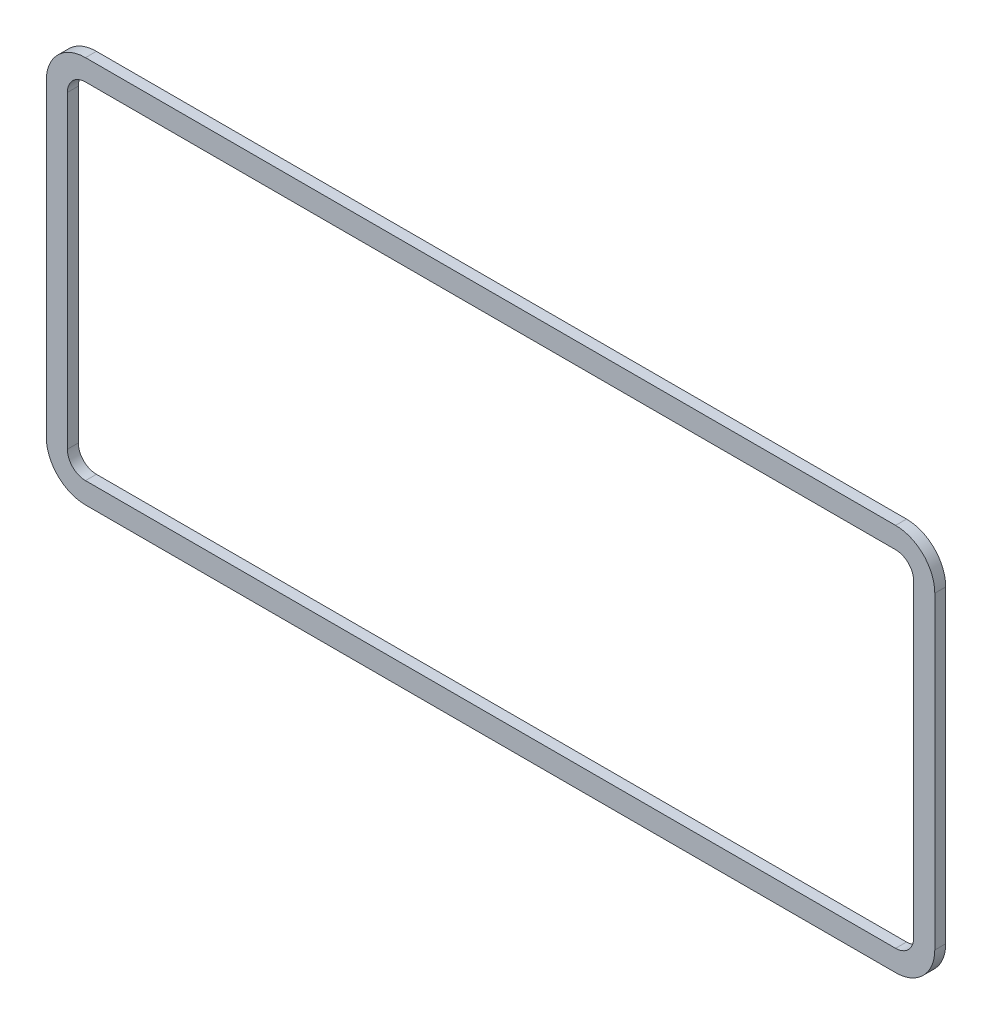
ISO-10303-21;
HEADER;
FILE_DESCRIPTION(('STEP AP214'),'2;1');
FILE_NAME('part.step','',(''),(''),'','','');
FILE_SCHEMA(('AUTOMOTIVE_DESIGN { 1 0 10303 214 1 1 1 1 }'));
ENDSEC;
DATA;
#1=APPLICATION_CONTEXT('core data for automotive mechanical design processes');
#2=APPLICATION_PROTOCOL_DEFINITION('international standard','automotive_design',2000,#1);
#3=PRODUCT_CONTEXT('',#1,'mechanical');
#4=PRODUCT('Part','Part','',(#3));
#5=PRODUCT_RELATED_PRODUCT_CATEGORY('part','',(#4));
#6=PRODUCT_DEFINITION_FORMATION('','',#4);
#7=PRODUCT_DEFINITION_CONTEXT('part definition',#1,'design');
#8=PRODUCT_DEFINITION('design','',#6,#7);
#9=PRODUCT_DEFINITION_SHAPE('','',#8);
#10=(LENGTH_UNIT() NAMED_UNIT(*) SI_UNIT(.MILLI.,.METRE.));
#11=(NAMED_UNIT(*) PLANE_ANGLE_UNIT() SI_UNIT($,.RADIAN.));
#12=(NAMED_UNIT(*) SI_UNIT($,.STERADIAN.) SOLID_ANGLE_UNIT());
#13=UNCERTAINTY_MEASURE_WITH_UNIT(LENGTH_MEASURE(1.E-05),#10,'distance_accuracy_value','');
#14=(GEOMETRIC_REPRESENTATION_CONTEXT(3) GLOBAL_UNCERTAINTY_ASSIGNED_CONTEXT((#13)) GLOBAL_UNIT_ASSIGNED_CONTEXT((#10,
#11,#12)) REPRESENTATION_CONTEXT('',''));
#15=CARTESIAN_POINT('',(0.,0.,0.));
#16=DIRECTION('',(0.,0.,1.));
#17=DIRECTION('',(1.,0.,0.));
#18=AXIS2_PLACEMENT_3D('',#15,#16,#17);
#19=CARTESIAN_POINT('',(-73.914,-28.194,0.));
#20=DIRECTION('',(0.,0.,1.));
#21=DIRECTION('',(1.,0.,0.));
#22=AXIS2_PLACEMENT_3D('',#19,#20,#21);
#23=PLANE('',#22);
#24=CARTESIAN_POINT('',(-73.914,-28.194,0.));
#25=DIRECTION('',(0.,0.,1.));
#26=DIRECTION('',(1.,0.,0.));
#27=AXIS2_PLACEMENT_3D('',#24,#25,#26);
#28=CIRCLE('',#27,7.15009999999999);
#29=CARTESIAN_POINT('',(-81.0641,-28.194,0.));
#30=VERTEX_POINT('',#29);
#31=CARTESIAN_POINT('',(-73.914,-35.3441,0.));
#32=VERTEX_POINT('',#31);
#33=EDGE_CURVE('E180',#30,#32,#28,.T.);
#34=ORIENTED_EDGE('',*,*,#33,.F.);
#35=DIRECTION('',(0.,-1.,0.));
#36=VECTOR('',#35,1.);
#37=CARTESIAN_POINT('',(-81.0641,28.194,0.));
#38=LINE('',#37,#36);
#39=CARTESIAN_POINT('',(-81.0641,28.194,0.));
#40=VERTEX_POINT('',#39);
#41=EDGE_CURVE('E134',#40,#30,#38,.T.);
#42=ORIENTED_EDGE('',*,*,#41,.F.);
#43=CARTESIAN_POINT('',(-73.914,28.194,0.));
#44=DIRECTION('',(0.,0.,1.));
#45=DIRECTION('',(1.,0.,0.));
#46=AXIS2_PLACEMENT_3D('',#43,#44,#45);
#47=CIRCLE('',#46,7.15009999999997);
#48=CARTESIAN_POINT('',(-73.914,35.3441,0.));
#49=VERTEX_POINT('',#48);
#50=EDGE_CURVE('E174',#49,#40,#47,.T.);
#51=ORIENTED_EDGE('',*,*,#50,.F.);
#52=DIRECTION('',(-1.,0.,0.));
#53=VECTOR('',#52,1.);
#54=CARTESIAN_POINT('',(73.9139999999999,35.3441,0.));
#55=LINE('',#54,#53);
#56=CARTESIAN_POINT('',(73.9139999999999,35.3441,0.));
#57=VERTEX_POINT('',#56);
#58=EDGE_CURVE('E170',#57,#49,#55,.T.);
#59=ORIENTED_EDGE('',*,*,#58,.F.);
#60=CARTESIAN_POINT('',(73.914,28.194,0.));
#61=DIRECTION('',(0.,0.,1.));
#62=DIRECTION('',(1.,0.,0.));
#63=AXIS2_PLACEMENT_3D('',#60,#61,#62);
#64=CIRCLE('',#63,7.1501);
#65=CARTESIAN_POINT('',(81.0641,28.194,0.));
#66=VERTEX_POINT('',#65);
#67=EDGE_CURVE('E166',#66,#57,#64,.T.);
#68=ORIENTED_EDGE('',*,*,#67,.F.);
#69=DIRECTION('',(0.,1.,0.));
#70=VECTOR('',#69,1.);
#71=CARTESIAN_POINT('',(81.0641,-28.194,0.));
#72=LINE('',#71,#70);
#73=CARTESIAN_POINT('',(81.0641,-28.194,0.));
#74=VERTEX_POINT('',#73);
#75=EDGE_CURVE('E162',#74,#66,#72,.T.);
#76=ORIENTED_EDGE('',*,*,#75,.F.);
#77=CARTESIAN_POINT('',(73.914,-28.194,0.));
#78=DIRECTION('',(0.,0.,1.));
#79=DIRECTION('',(1.,0.,0.));
#80=AXIS2_PLACEMENT_3D('',#77,#78,#79);
#81=CIRCLE('',#80,7.15009999999999);
#82=CARTESIAN_POINT('',(73.914,-35.3441,0.));
#83=VERTEX_POINT('',#82);
#84=EDGE_CURVE('E158',#83,#74,#81,.T.);
#85=ORIENTED_EDGE('',*,*,#84,.F.);
#86=DIRECTION('',(1.,0.,0.));
#87=VECTOR('',#86,1.);
#88=CARTESIAN_POINT('',(-73.914,-35.3441,0.));
#89=LINE('',#88,#87);
#90=EDGE_CURVE('E154',#32,#83,#89,.T.);
#91=ORIENTED_EDGE('',*,*,#90,.F.);
#92=EDGE_LOOP('',(#34,#42,#51,#59,#68,#76,#85,#91));
#93=FACE_BOUND('',#92,.T.);
#94=CARTESIAN_POINT('',(-73.914,-28.194,0.));
#95=DIRECTION('',(0.,0.,1.));
#96=DIRECTION('',(1.,0.,0.));
#97=AXIS2_PLACEMENT_3D('',#94,#95,#96);
#98=CIRCLE('',#97,3.302);
#99=CARTESIAN_POINT('',(-77.216,-28.194,0.));
#100=VERTEX_POINT('',#99);
#101=CARTESIAN_POINT('',(-73.914,-31.496,0.));
#102=VERTEX_POINT('',#101);
#103=EDGE_CURVE('E130',#100,#102,#98,.T.);
#104=ORIENTED_EDGE('',*,*,#103,.T.);
#105=DIRECTION('',(1.,0.,0.));
#106=VECTOR('',#105,1.);
#107=CARTESIAN_POINT('',(-73.914,-31.496,0.));
#108=LINE('',#107,#106);
#109=CARTESIAN_POINT('',(73.914,-31.496,0.));
#110=VERTEX_POINT('',#109);
#111=EDGE_CURVE('E137',#102,#110,#108,.T.);
#112=ORIENTED_EDGE('',*,*,#111,.T.);
#113=CARTESIAN_POINT('',(73.914,-28.194,0.));
#114=DIRECTION('',(0.,0.,1.));
#115=DIRECTION('',(1.,0.,0.));
#116=AXIS2_PLACEMENT_3D('',#113,#114,#115);
#117=CIRCLE('',#116,3.302);
#118=CARTESIAN_POINT('',(77.216,-28.194,0.));
#119=VERTEX_POINT('',#118);
#120=EDGE_CURVE('E141',#110,#119,#117,.T.);
#121=ORIENTED_EDGE('',*,*,#120,.T.);
#122=DIRECTION('',(0.,1.,0.));
#123=VECTOR('',#122,1.);
#124=CARTESIAN_POINT('',(77.216,-28.194,0.));
#125=LINE('',#124,#123);
#126=CARTESIAN_POINT('',(77.216,28.194,0.));
#127=VERTEX_POINT('',#126);
#128=EDGE_CURVE('E246',#119,#127,#125,.T.);
#129=ORIENTED_EDGE('',*,*,#128,.T.);
#130=CARTESIAN_POINT('',(73.914,28.194,0.));
#131=DIRECTION('',(0.,0.,1.));
#132=DIRECTION('',(1.,0.,0.));
#133=AXIS2_PLACEMENT_3D('',#130,#131,#132);
#134=CIRCLE('',#133,3.30199999999999);
#135=CARTESIAN_POINT('',(73.914,31.496,0.));
#136=VERTEX_POINT('',#135);
#137=EDGE_CURVE('E244',#127,#136,#134,.T.);
#138=ORIENTED_EDGE('',*,*,#137,.T.);
#139=DIRECTION('',(-1.,0.,0.));
#140=VECTOR('',#139,1.);
#141=CARTESIAN_POINT('',(73.914,31.496,0.));
#142=LINE('',#141,#140);
#143=CARTESIAN_POINT('',(-73.914,31.496,0.));
#144=VERTEX_POINT('',#143);
#145=EDGE_CURVE('E239',#136,#144,#142,.T.);
#146=ORIENTED_EDGE('',*,*,#145,.T.);
#147=CARTESIAN_POINT('',(-73.914,28.194,0.));
#148=DIRECTION('',(0.,0.,1.));
#149=DIRECTION('',(1.,0.,0.));
#150=AXIS2_PLACEMENT_3D('',#147,#148,#149);
#151=CIRCLE('',#150,3.302);
#152=CARTESIAN_POINT('',(-77.216,28.194,0.));
#153=VERTEX_POINT('',#152);
#154=EDGE_CURVE('E237',#144,#153,#151,.T.);
#155=ORIENTED_EDGE('',*,*,#154,.T.);
#156=DIRECTION('',(0.,-1.,0.));
#157=VECTOR('',#156,1.);
#158=CARTESIAN_POINT('',(-77.216,28.194,0.));
#159=LINE('',#158,#157);
#160=EDGE_CURVE('E145',#153,#100,#159,.T.);
#161=ORIENTED_EDGE('',*,*,#160,.T.);
#162=EDGE_LOOP('',(#104,#112,#121,#129,#138,#146,#155,#161));
#163=FACE_BOUND('',#162,.T.);
#164=ADVANCED_FACE('F39',(#93,#163),#23,.F.);
#165=CARTESIAN_POINT('',(-73.914,-28.194,178.862141508983));
#166=DIRECTION('',(0.,0.,-1.));
#167=DIRECTION('',(-1.,0.,0.));
#168=AXIS2_PLACEMENT_3D('',#165,#166,#167);
#169=CYLINDRICAL_SURFACE('',#168,7.15009999999999);
#170=DIRECTION('',(0.,0.,-1.));
#171=VECTOR('',#170,1.);
#172=CARTESIAN_POINT('',(-73.914,-35.3441,178.862141508983));
#173=LINE('',#172,#171);
#174=CARTESIAN_POINT('',(-73.914,-35.3441,1.99389999999999));
#175=VERTEX_POINT('',#174);
#176=EDGE_CURVE('E152',#175,#32,#173,.T.);
#177=ORIENTED_EDGE('',*,*,#176,.F.);
#178=CARTESIAN_POINT('',(-73.914,-28.194,1.99389999999999));
#179=DIRECTION('',(0.,0.,-1.));
#180=DIRECTION('',(-1.,0.,0.));
#181=AXIS2_PLACEMENT_3D('',#178,#179,#180);
#182=CIRCLE('',#181,7.15009999999999);
#183=CARTESIAN_POINT('',(-81.0641,-28.194,1.99389999999999));
#184=VERTEX_POINT('',#183);
#185=EDGE_CURVE('E58',#175,#184,#182,.T.);
#186=ORIENTED_EDGE('',*,*,#185,.T.);
#187=DIRECTION('',(0.,0.,-1.));
#188=VECTOR('',#187,1.);
#189=CARTESIAN_POINT('',(-81.0641,-28.194,178.862141508983));
#190=LINE('',#189,#188);
#191=EDGE_CURVE('E179',#184,#30,#190,.T.);
#192=ORIENTED_EDGE('',*,*,#191,.T.);
#193=ORIENTED_EDGE('',*,*,#33,.T.);
#194=EDGE_LOOP('',(#177,#186,#192,#193));
#195=FACE_BOUND('',#194,.T.);
#196=ADVANCED_FACE('F315',(#195),#169,.T.);
#197=CARTESIAN_POINT('',(-73.914,-35.3441,178.862141508983));
#198=DIRECTION('',(0.,1.,0.));
#199=DIRECTION('',(-1.,0.,0.));
#200=AXIS2_PLACEMENT_3D('',#197,#198,#199);
#201=PLANE('',#200);
#202=DIRECTION('',(0.,0.,-1.));
#203=VECTOR('',#202,1.);
#204=CARTESIAN_POINT('',(73.914,-35.3441,178.862141508983));
#205=LINE('',#204,#203);
#206=CARTESIAN_POINT('',(73.914,-35.3441,1.99389999999999));
#207=VERTEX_POINT('',#206);
#208=EDGE_CURVE('E156',#207,#83,#205,.T.);
#209=ORIENTED_EDGE('',*,*,#208,.F.);
#210=DIRECTION('',(-1.,0.,0.));
#211=VECTOR('',#210,1.);
#212=CARTESIAN_POINT('',(-73.914,-35.3441,1.99389999999999));
#213=LINE('',#212,#211);
#214=EDGE_CURVE('E155',#207,#175,#213,.T.);
#215=ORIENTED_EDGE('',*,*,#214,.T.);
#216=ORIENTED_EDGE('',*,*,#176,.T.);
#217=ORIENTED_EDGE('',*,*,#90,.T.);
#218=EDGE_LOOP('',(#209,#215,#216,#217));
#219=FACE_BOUND('',#218,.T.);
#220=ADVANCED_FACE('F286',(#219),#201,.F.);
#221=CARTESIAN_POINT('',(73.914,-28.194,178.862141508983));
#222=DIRECTION('',(0.,0.,-1.));
#223=DIRECTION('',(-1.,0.,0.));
#224=AXIS2_PLACEMENT_3D('',#221,#222,#223);
#225=CYLINDRICAL_SURFACE('',#224,7.15009999999999);
#226=DIRECTION('',(0.,0.,-1.));
#227=VECTOR('',#226,1.);
#228=CARTESIAN_POINT('',(81.0641,-28.194,178.862141508983));
#229=LINE('',#228,#227);
#230=CARTESIAN_POINT('',(81.0641,-28.194,1.99389999999999));
#231=VERTEX_POINT('',#230);
#232=EDGE_CURVE('E160',#231,#74,#229,.T.);
#233=ORIENTED_EDGE('',*,*,#232,.F.);
#234=CARTESIAN_POINT('',(73.914,-28.194,1.99389999999999));
#235=DIRECTION('',(0.,0.,-1.));
#236=DIRECTION('',(-1.,0.,0.));
#237=AXIS2_PLACEMENT_3D('',#234,#235,#236);
#238=CIRCLE('',#237,7.15009999999999);
#239=EDGE_CURVE('E159',#231,#207,#238,.T.);
#240=ORIENTED_EDGE('',*,*,#239,.T.);
#241=ORIENTED_EDGE('',*,*,#208,.T.);
#242=ORIENTED_EDGE('',*,*,#84,.T.);
#243=EDGE_LOOP('',(#233,#240,#241,#242));
#244=FACE_BOUND('',#243,.T.);
#245=ADVANCED_FACE('F291',(#244),#225,.T.);
#246=CARTESIAN_POINT('',(81.0641,-28.194,178.862141508983));
#247=DIRECTION('',(-1.,0.,0.));
#248=DIRECTION('',(0.,0.,1.));
#249=AXIS2_PLACEMENT_3D('',#246,#247,#248);
#250=PLANE('',#249);
#251=DIRECTION('',(0.,0.,-1.));
#252=VECTOR('',#251,1.);
#253=CARTESIAN_POINT('',(81.0641,28.194,178.862141508983));
#254=LINE('',#253,#252);
#255=CARTESIAN_POINT('',(81.0641,28.194,1.99389999999999));
#256=VERTEX_POINT('',#255);
#257=EDGE_CURVE('E164',#256,#66,#254,.T.);
#258=ORIENTED_EDGE('',*,*,#257,.F.);
#259=DIRECTION('',(0.,-1.,0.));
#260=VECTOR('',#259,1.);
#261=CARTESIAN_POINT('',(81.0641,-28.194,1.99389999999999));
#262=LINE('',#261,#260);
#263=EDGE_CURVE('E163',#256,#231,#262,.T.);
#264=ORIENTED_EDGE('',*,*,#263,.T.);
#265=ORIENTED_EDGE('',*,*,#232,.T.);
#266=ORIENTED_EDGE('',*,*,#75,.T.);
#267=EDGE_LOOP('',(#258,#264,#265,#266));
#268=FACE_BOUND('',#267,.T.);
#269=ADVANCED_FACE('F296',(#268),#250,.F.);
#270=CARTESIAN_POINT('',(73.914,28.194,178.862141508983));
#271=DIRECTION('',(0.,0.,-1.));
#272=DIRECTION('',(-1.,0.,0.));
#273=AXIS2_PLACEMENT_3D('',#270,#271,#272);
#274=CYLINDRICAL_SURFACE('',#273,7.1501);
#275=DIRECTION('',(0.,0.,-1.));
#276=VECTOR('',#275,1.);
#277=CARTESIAN_POINT('',(73.9139999999999,35.3441,178.862141508983));
#278=LINE('',#277,#276);
#279=CARTESIAN_POINT('',(73.9139999999999,35.3441,1.99389999999999));
#280=VERTEX_POINT('',#279);
#281=EDGE_CURVE('E168',#280,#57,#278,.T.);
#282=ORIENTED_EDGE('',*,*,#281,.F.);
#283=CARTESIAN_POINT('',(73.914,28.194,1.99389999999999));
#284=DIRECTION('',(0.,0.,-1.));
#285=DIRECTION('',(-1.,0.,0.));
#286=AXIS2_PLACEMENT_3D('',#283,#284,#285);
#287=CIRCLE('',#286,7.1501);
#288=EDGE_CURVE('E167',#280,#256,#287,.T.);
#289=ORIENTED_EDGE('',*,*,#288,.T.);
#290=ORIENTED_EDGE('',*,*,#257,.T.);
#291=ORIENTED_EDGE('',*,*,#67,.T.);
#292=EDGE_LOOP('',(#282,#289,#290,#291));
#293=FACE_BOUND('',#292,.T.);
#294=ADVANCED_FACE('F301',(#293),#274,.T.);
#295=CARTESIAN_POINT('',(73.9139999999999,35.3441,178.862141508983));
#296=DIRECTION('',(0.,-1.,0.));
#297=DIRECTION('',(1.,0.,0.));
#298=AXIS2_PLACEMENT_3D('',#295,#296,#297);
#299=PLANE('',#298);
#300=DIRECTION('',(0.,0.,-1.));
#301=VECTOR('',#300,1.);
#302=CARTESIAN_POINT('',(-73.914,35.3441,178.862141508983));
#303=LINE('',#302,#301);
#304=CARTESIAN_POINT('',(-73.914,35.3441,1.99389999999999));
#305=VERTEX_POINT('',#304);
#306=EDGE_CURVE('E172',#305,#49,#303,.T.);
#307=ORIENTED_EDGE('',*,*,#306,.F.);
#308=DIRECTION('',(1.,0.,0.));
#309=VECTOR('',#308,1.);
#310=CARTESIAN_POINT('',(73.9139999999999,35.3441,1.99389999999999));
#311=LINE('',#310,#309);
#312=EDGE_CURVE('E171',#305,#280,#311,.T.);
#313=ORIENTED_EDGE('',*,*,#312,.T.);
#314=ORIENTED_EDGE('',*,*,#281,.T.);
#315=ORIENTED_EDGE('',*,*,#58,.T.);
#316=EDGE_LOOP('',(#307,#313,#314,#315));
#317=FACE_BOUND('',#316,.T.);
#318=ADVANCED_FACE('F306',(#317),#299,.F.);
#319=CARTESIAN_POINT('',(-73.914,28.194,178.862141508983));
#320=DIRECTION('',(0.,0.,-1.));
#321=DIRECTION('',(-1.,0.,0.));
#322=AXIS2_PLACEMENT_3D('',#319,#320,#321);
#323=CYLINDRICAL_SURFACE('',#322,7.15009999999997);
#324=DIRECTION('',(0.,0.,-1.));
#325=VECTOR('',#324,1.);
#326=CARTESIAN_POINT('',(-81.0641,28.194,178.862141508983));
#327=LINE('',#326,#325);
#328=CARTESIAN_POINT('',(-81.0641,28.194,1.99389999999999));
#329=VERTEX_POINT('',#328);
#330=EDGE_CURVE('E176',#329,#40,#327,.T.);
#331=ORIENTED_EDGE('',*,*,#330,.F.);
#332=CARTESIAN_POINT('',(-73.914,28.194,1.99389999999999));
#333=DIRECTION('',(0.,0.,-1.));
#334=DIRECTION('',(-1.,0.,0.));
#335=AXIS2_PLACEMENT_3D('',#332,#333,#334);
#336=CIRCLE('',#335,7.15009999999997);
#337=EDGE_CURVE('E175',#329,#305,#336,.T.);
#338=ORIENTED_EDGE('',*,*,#337,.T.);
#339=ORIENTED_EDGE('',*,*,#306,.T.);
#340=ORIENTED_EDGE('',*,*,#50,.T.);
#341=EDGE_LOOP('',(#331,#338,#339,#340));
#342=FACE_BOUND('',#341,.T.);
#343=ADVANCED_FACE('F311',(#342),#323,.T.);
#344=CARTESIAN_POINT('',(-81.0641,28.194,178.862141508983));
#345=DIRECTION('',(1.,0.,0.));
#346=DIRECTION('',(0.,0.,-1.));
#347=AXIS2_PLACEMENT_3D('',#344,#345,#346);
#348=PLANE('',#347);
#349=ORIENTED_EDGE('',*,*,#191,.F.);
#350=DIRECTION('',(0.,1.,0.));
#351=VECTOR('',#350,1.);
#352=CARTESIAN_POINT('',(-81.0641,28.194,1.99389999999999));
#353=LINE('',#352,#351);
#354=EDGE_CURVE('E178',#184,#329,#353,.T.);
#355=ORIENTED_EDGE('',*,*,#354,.T.);
#356=ORIENTED_EDGE('',*,*,#330,.T.);
#357=ORIENTED_EDGE('',*,*,#41,.T.);
#358=EDGE_LOOP('',(#349,#355,#356,#357));
#359=FACE_BOUND('',#358,.T.);
#360=ADVANCED_FACE('F318',(#359),#348,.F.);
#361=CARTESIAN_POINT('',(-73.914,-28.194,178.862141508983));
#362=DIRECTION('',(0.,0.,-1.));
#363=DIRECTION('',(-1.,0.,0.));
#364=AXIS2_PLACEMENT_3D('',#361,#362,#363);
#365=CYLINDRICAL_SURFACE('',#364,3.302);
#366=CARTESIAN_POINT('',(-73.914,-28.194,1.99389999999999));
#367=DIRECTION('',(0.,0.,-1.));
#368=DIRECTION('',(-1.,0.,0.));
#369=AXIS2_PLACEMENT_3D('',#366,#367,#368);
#370=CIRCLE('',#369,3.302);
#371=CARTESIAN_POINT('',(-73.914,-31.496,1.99389999999999));
#372=VERTEX_POINT('',#371);
#373=CARTESIAN_POINT('',(-77.216,-28.194,1.99389999999999));
#374=VERTEX_POINT('',#373);
#375=EDGE_CURVE('E133',#372,#374,#370,.T.);
#376=ORIENTED_EDGE('',*,*,#375,.F.);
#377=DIRECTION('',(0.,0.,-1.));
#378=VECTOR('',#377,1.);
#379=CARTESIAN_POINT('',(-73.914,-31.496,178.862141508983));
#380=LINE('',#379,#378);
#381=EDGE_CURVE('E126',#372,#102,#380,.T.);
#382=ORIENTED_EDGE('',*,*,#381,.T.);
#383=ORIENTED_EDGE('',*,*,#103,.F.);
#384=DIRECTION('',(0.,0.,-1.));
#385=VECTOR('',#384,1.);
#386=CARTESIAN_POINT('',(-77.216,-28.194,178.862141508983));
#387=LINE('',#386,#385);
#388=EDGE_CURVE('E193',#374,#100,#387,.T.);
#389=ORIENTED_EDGE('',*,*,#388,.F.);
#390=EDGE_LOOP('',(#376,#382,#383,#389));
#391=FACE_BOUND('',#390,.T.);
#392=ADVANCED_FACE('F127',(#391),#365,.F.);
#393=CARTESIAN_POINT('',(-73.914,-31.496,178.862141508983));
#394=DIRECTION('',(0.,1.,0.));
#395=DIRECTION('',(-1.,0.,0.));
#396=AXIS2_PLACEMENT_3D('',#393,#394,#395);
#397=PLANE('',#396);
#398=DIRECTION('',(-1.,0.,0.));
#399=VECTOR('',#398,1.);
#400=CARTESIAN_POINT('',(-73.914,-31.496,1.99389999999999));
#401=LINE('',#400,#399);
#402=CARTESIAN_POINT('',(73.914,-31.496,1.99389999999999));
#403=VERTEX_POINT('',#402);
#404=EDGE_CURVE('E11',#403,#372,#401,.T.);
#405=ORIENTED_EDGE('',*,*,#404,.F.);
#406=DIRECTION('',(0.,0.,-1.));
#407=VECTOR('',#406,1.);
#408=CARTESIAN_POINT('',(73.914,-31.496,178.862141508983));
#409=LINE('',#408,#407);
#410=EDGE_CURVE('E119',#403,#110,#409,.T.);
#411=ORIENTED_EDGE('',*,*,#410,.T.);
#412=ORIENTED_EDGE('',*,*,#111,.F.);
#413=ORIENTED_EDGE('',*,*,#381,.F.);
#414=EDGE_LOOP('',(#405,#411,#412,#413));
#415=FACE_BOUND('',#414,.T.);
#416=ADVANCED_FACE('F138',(#415),#397,.T.);
#417=CARTESIAN_POINT('',(73.914,-28.194,178.862141508983));
#418=DIRECTION('',(0.,0.,-1.));
#419=DIRECTION('',(-1.,0.,0.));
#420=AXIS2_PLACEMENT_3D('',#417,#418,#419);
#421=CYLINDRICAL_SURFACE('',#420,3.302);
#422=CARTESIAN_POINT('',(73.914,-28.194,1.99389999999999));
#423=DIRECTION('',(0.,0.,-1.));
#424=DIRECTION('',(-1.,0.,0.));
#425=AXIS2_PLACEMENT_3D('',#422,#423,#424);
#426=CIRCLE('',#425,3.302);
#427=CARTESIAN_POINT('',(77.216,-28.194,1.99389999999999));
#428=VERTEX_POINT('',#427);
#429=EDGE_CURVE('E49',#428,#403,#426,.T.);
#430=ORIENTED_EDGE('',*,*,#429,.F.);
#431=DIRECTION('',(0.,0.,-1.));
#432=VECTOR('',#431,1.);
#433=CARTESIAN_POINT('',(77.216,-28.194,178.862141508983));
#434=LINE('',#433,#432);
#435=EDGE_CURVE('E183',#428,#119,#434,.T.);
#436=ORIENTED_EDGE('',*,*,#435,.T.);
#437=ORIENTED_EDGE('',*,*,#120,.F.);
#438=ORIENTED_EDGE('',*,*,#410,.F.);
#439=EDGE_LOOP('',(#430,#436,#437,#438));
#440=FACE_BOUND('',#439,.T.);
#441=ADVANCED_FACE('F253',(#440),#421,.F.);
#442=CARTESIAN_POINT('',(77.216,-28.194,178.862141508983));
#443=DIRECTION('',(-1.,0.,0.));
#444=DIRECTION('',(0.,-1.,0.));
#445=AXIS2_PLACEMENT_3D('',#442,#443,#444);
#446=PLANE('',#445);
#447=DIRECTION('',(0.,-1.,0.));
#448=VECTOR('',#447,1.);
#449=CARTESIAN_POINT('',(77.216,-28.194,1.99389999999999));
#450=LINE('',#449,#448);
#451=CARTESIAN_POINT('',(77.216,28.194,1.99389999999999));
#452=VERTEX_POINT('',#451);
#453=EDGE_CURVE('E213',#452,#428,#450,.T.);
#454=ORIENTED_EDGE('',*,*,#453,.F.);
#455=DIRECTION('',(0.,0.,-1.));
#456=VECTOR('',#455,1.);
#457=CARTESIAN_POINT('',(77.216,28.194,178.862141508983));
#458=LINE('',#457,#456);
#459=EDGE_CURVE('E185',#452,#127,#458,.T.);
#460=ORIENTED_EDGE('',*,*,#459,.T.);
#461=ORIENTED_EDGE('',*,*,#128,.F.);
#462=ORIENTED_EDGE('',*,*,#435,.F.);
#463=EDGE_LOOP('',(#454,#460,#461,#462));
#464=FACE_BOUND('',#463,.T.);
#465=ADVANCED_FACE('F259',(#464),#446,.T.);
#466=CARTESIAN_POINT('',(73.914,28.194,178.862141508983));
#467=DIRECTION('',(0.,0.,-1.));
#468=DIRECTION('',(-1.,0.,0.));
#469=AXIS2_PLACEMENT_3D('',#466,#467,#468);
#470=CYLINDRICAL_SURFACE('',#469,3.30199999999999);
#471=CARTESIAN_POINT('',(73.914,28.194,1.99389999999999));
#472=DIRECTION('',(0.,0.,-1.));
#473=DIRECTION('',(-1.,0.,0.));
#474=AXIS2_PLACEMENT_3D('',#471,#472,#473);
#475=CIRCLE('',#474,3.30199999999999);
#476=CARTESIAN_POINT('',(73.914,31.496,1.99389999999999));
#477=VERTEX_POINT('',#476);
#478=EDGE_CURVE('E216',#477,#452,#475,.T.);
#479=ORIENTED_EDGE('',*,*,#478,.F.);
#480=DIRECTION('',(0.,0.,-1.));
#481=VECTOR('',#480,1.);
#482=CARTESIAN_POINT('',(73.914,31.496,178.862141508983));
#483=LINE('',#482,#481);
#484=EDGE_CURVE('E187',#477,#136,#483,.T.);
#485=ORIENTED_EDGE('',*,*,#484,.T.);
#486=ORIENTED_EDGE('',*,*,#137,.F.);
#487=ORIENTED_EDGE('',*,*,#459,.F.);
#488=EDGE_LOOP('',(#479,#485,#486,#487));
#489=FACE_BOUND('',#488,.T.);
#490=ADVANCED_FACE('F263',(#489),#470,.F.);
#491=CARTESIAN_POINT('',(73.914,31.496,178.862141508983));
#492=DIRECTION('',(0.,-1.,0.));
#493=DIRECTION('',(1.,0.,0.));
#494=AXIS2_PLACEMENT_3D('',#491,#492,#493);
#495=PLANE('',#494);
#496=DIRECTION('',(1.,0.,0.));
#497=VECTOR('',#496,1.);
#498=CARTESIAN_POINT('',(73.914,31.496,1.99389999999999));
#499=LINE('',#498,#497);
#500=CARTESIAN_POINT('',(-73.914,31.496,1.99389999999999));
#501=VERTEX_POINT('',#500);
#502=EDGE_CURVE('E218',#501,#477,#499,.T.);
#503=ORIENTED_EDGE('',*,*,#502,.F.);
#504=DIRECTION('',(0.,0.,-1.));
#505=VECTOR('',#504,1.);
#506=CARTESIAN_POINT('',(-73.914,31.496,178.862141508983));
#507=LINE('',#506,#505);
#508=EDGE_CURVE('E189',#501,#144,#507,.T.);
#509=ORIENTED_EDGE('',*,*,#508,.T.);
#510=ORIENTED_EDGE('',*,*,#145,.F.);
#511=ORIENTED_EDGE('',*,*,#484,.F.);
#512=EDGE_LOOP('',(#503,#509,#510,#511));
#513=FACE_BOUND('',#512,.T.);
#514=ADVANCED_FACE('F233',(#513),#495,.T.);
#515=CARTESIAN_POINT('',(-73.914,28.194,178.862141508983));
#516=DIRECTION('',(0.,0.,-1.));
#517=DIRECTION('',(-1.,0.,0.));
#518=AXIS2_PLACEMENT_3D('',#515,#516,#517);
#519=CYLINDRICAL_SURFACE('',#518,3.302);
#520=CARTESIAN_POINT('',(-73.914,28.194,1.99389999999999));
#521=DIRECTION('',(0.,0.,-1.));
#522=DIRECTION('',(-1.,0.,0.));
#523=AXIS2_PLACEMENT_3D('',#520,#521,#522);
#524=CIRCLE('',#523,3.302);
#525=CARTESIAN_POINT('',(-77.216,28.194,1.99389999999999));
#526=VERTEX_POINT('',#525);
#527=EDGE_CURVE('E43',#526,#501,#524,.T.);
#528=ORIENTED_EDGE('',*,*,#527,.F.);
#529=DIRECTION('',(0.,0.,-1.));
#530=VECTOR('',#529,1.);
#531=CARTESIAN_POINT('',(-77.216,28.194,178.862141508983));
#532=LINE('',#531,#530);
#533=EDGE_CURVE('E191',#526,#153,#532,.T.);
#534=ORIENTED_EDGE('',*,*,#533,.T.);
#535=ORIENTED_EDGE('',*,*,#154,.F.);
#536=ORIENTED_EDGE('',*,*,#508,.F.);
#537=EDGE_LOOP('',(#528,#534,#535,#536));
#538=FACE_BOUND('',#537,.T.);
#539=ADVANCED_FACE('F236',(#538),#519,.F.);
#540=CARTESIAN_POINT('',(-77.216,28.194,178.862141508983));
#541=DIRECTION('',(1.,0.,0.));
#542=DIRECTION('',(0.,1.,0.));
#543=AXIS2_PLACEMENT_3D('',#540,#541,#542);
#544=PLANE('',#543);
#545=DIRECTION('',(0.,1.,0.));
#546=VECTOR('',#545,1.);
#547=CARTESIAN_POINT('',(-77.216,28.194,1.99389999999999));
#548=LINE('',#547,#546);
#549=EDGE_CURVE('E149',#374,#526,#548,.T.);
#550=ORIENTED_EDGE('',*,*,#549,.F.);
#551=ORIENTED_EDGE('',*,*,#388,.T.);
#552=ORIENTED_EDGE('',*,*,#160,.F.);
#553=ORIENTED_EDGE('',*,*,#533,.F.);
#554=EDGE_LOOP('',(#550,#551,#552,#553));
#555=FACE_BOUND('',#554,.T.);
#556=ADVANCED_FACE('F351',(#555),#544,.T.);
#557=CARTESIAN_POINT('',(0.,0.,1.9939));
#558=DIRECTION('',(0.,0.,-1.));
#559=DIRECTION('',(0.,1.,0.));
#560=AXIS2_PLACEMENT_3D('',#557,#558,#559);
#561=PLANE('',#560);
#562=ORIENTED_EDGE('',*,*,#375,.T.);
#563=ORIENTED_EDGE('',*,*,#549,.T.);
#564=ORIENTED_EDGE('',*,*,#527,.T.);
#565=ORIENTED_EDGE('',*,*,#502,.T.);
#566=ORIENTED_EDGE('',*,*,#478,.T.);
#567=ORIENTED_EDGE('',*,*,#453,.T.);
#568=ORIENTED_EDGE('',*,*,#429,.T.);
#569=ORIENTED_EDGE('',*,*,#404,.T.);
#570=EDGE_LOOP('',(#562,#563,#564,#565,#566,#567,#568,#569));
#571=FACE_BOUND('',#570,.T.);
#572=ORIENTED_EDGE('',*,*,#214,.F.);
#573=ORIENTED_EDGE('',*,*,#239,.F.);
#574=ORIENTED_EDGE('',*,*,#263,.F.);
#575=ORIENTED_EDGE('',*,*,#288,.F.);
#576=ORIENTED_EDGE('',*,*,#312,.F.);
#577=ORIENTED_EDGE('',*,*,#337,.F.);
#578=ORIENTED_EDGE('',*,*,#354,.F.);
#579=ORIENTED_EDGE('',*,*,#185,.F.);
#580=EDGE_LOOP('',(#572,#573,#574,#575,#576,#577,#578,#579));
#581=FACE_BOUND('',#580,.T.);
#582=ADVANCED_FACE('F41',(#571,#581),#561,.F.);
#583=CLOSED_SHELL('',(#164,#196,#220,#245,#269,#294,#318,#343,#360,#392,#416,#441,#465,#490,
#514,#539,#556,#582));
#584=MANIFOLD_SOLID_BREP('B2',#583);
#585=ADVANCED_BREP_SHAPE_REPRESENTATION('',(#18,#584),#14);
#586=SHAPE_DEFINITION_REPRESENTATION(#9,#585);
ENDSEC;
END-ISO-10303-21;
